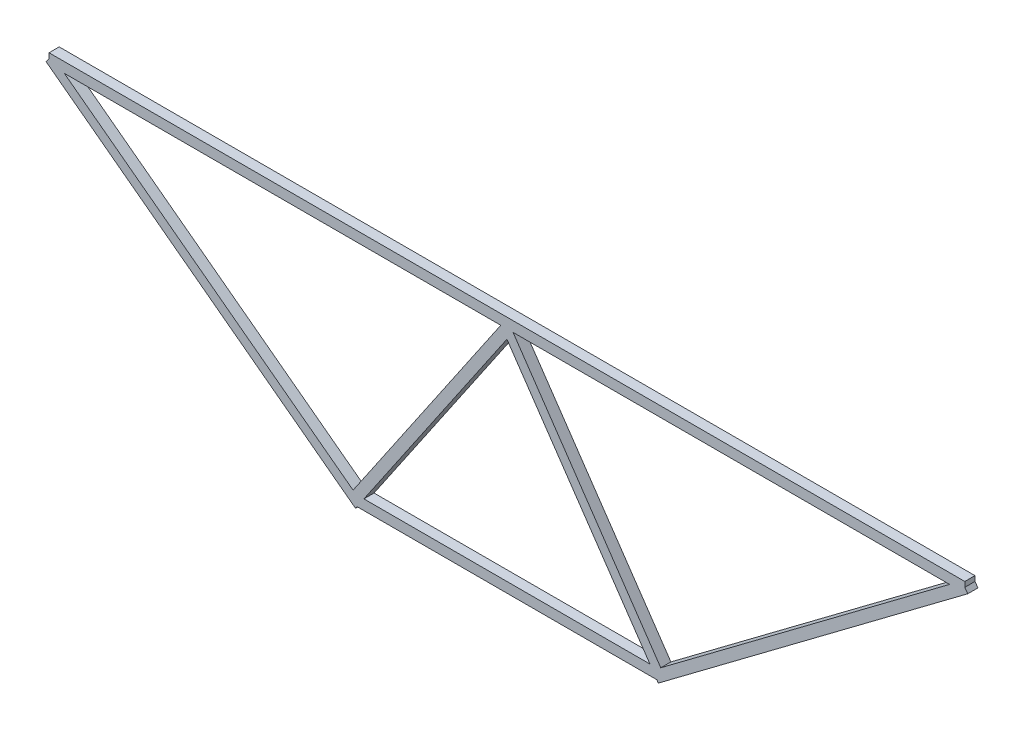
ISO-10303-21;
HEADER;
FILE_DESCRIPTION(('STEP AP214'),'2;1');
FILE_NAME('part.step','',(''),(''),'','','');
FILE_SCHEMA(('AUTOMOTIVE_DESIGN { 1 0 10303 214 1 1 1 1 }'));
ENDSEC;
DATA;
#1=APPLICATION_CONTEXT('core data for automotive mechanical design processes');
#2=APPLICATION_PROTOCOL_DEFINITION('international standard','automotive_design',2000,#1);
#3=PRODUCT_CONTEXT('',#1,'mechanical');
#4=PRODUCT('Part','Part','',(#3));
#5=PRODUCT_RELATED_PRODUCT_CATEGORY('part','',(#4));
#6=PRODUCT_DEFINITION_FORMATION('','',#4);
#7=PRODUCT_DEFINITION_CONTEXT('part definition',#1,'design');
#8=PRODUCT_DEFINITION('design','',#6,#7);
#9=PRODUCT_DEFINITION_SHAPE('','',#8);
#10=(LENGTH_UNIT() NAMED_UNIT(*) SI_UNIT(.MILLI.,.METRE.));
#11=(NAMED_UNIT(*) PLANE_ANGLE_UNIT() SI_UNIT($,.RADIAN.));
#12=(NAMED_UNIT(*) SI_UNIT($,.STERADIAN.) SOLID_ANGLE_UNIT());
#13=UNCERTAINTY_MEASURE_WITH_UNIT(LENGTH_MEASURE(1.E-05),#10,'distance_accuracy_value','');
#14=(GEOMETRIC_REPRESENTATION_CONTEXT(3) GLOBAL_UNCERTAINTY_ASSIGNED_CONTEXT((#13)) GLOBAL_UNIT_ASSIGNED_CONTEXT((#10,
#11,#12)) REPRESENTATION_CONTEXT('',''));
#15=CARTESIAN_POINT('',(0.,0.,0.));
#16=DIRECTION('',(0.,0.,1.));
#17=DIRECTION('',(1.,0.,0.));
#18=AXIS2_PLACEMENT_3D('',#15,#16,#17);
#19=CARTESIAN_POINT('',(405.494510894513,-310.396044584635,6.65));
#20=DIRECTION('',(-0.826242239776454,0.563314975133086,0.));
#21=DIRECTION('',(-0.563314975133086,-0.826242239776454,0.));
#22=AXIS2_PLACEMENT_3D('',#19,#20,#21);
#23=PLANE('',#22);
#24=DIRECTION('',(0.,0.,-1.));
#25=VECTOR('',#24,1.);
#26=CARTESIAN_POINT('',(403.514653785009,-313.3,6.65));
#27=LINE('',#26,#25);
#28=CARTESIAN_POINT('',(403.514653785009,-313.3,6.65));
#29=VERTEX_POINT('',#28);
#30=CARTESIAN_POINT('',(403.514653785009,-313.3,-6.65));
#31=VERTEX_POINT('',#30);
#32=EDGE_CURVE('E338',#29,#31,#27,.T.);
#33=ORIENTED_EDGE('',*,*,#32,.F.);
#34=DIRECTION('',(0.563314975133086,0.826242239776454,0.));
#35=VECTOR('',#34,1.);
#36=CARTESIAN_POINT('',(405.494510894513,-310.396044584635,6.65));
#37=LINE('',#36,#35);
#38=CARTESIAN_POINT('',(401.575558109468,-316.144168582101,6.65));
#39=VERTEX_POINT('',#38);
#40=EDGE_CURVE('E327',#39,#29,#37,.T.);
#41=ORIENTED_EDGE('',*,*,#40,.F.);
#42=DIRECTION('',(0.,0.,-1.));
#43=VECTOR('',#42,1.);
#44=CARTESIAN_POINT('',(401.575558109468,-316.144168582101,6.65));
#45=LINE('',#44,#43);
#46=CARTESIAN_POINT('',(401.575558109468,-316.144168582101,-6.65));
#47=VERTEX_POINT('',#46);
#48=EDGE_CURVE('E212',#39,#47,#45,.T.);
#49=ORIENTED_EDGE('',*,*,#48,.T.);
#50=DIRECTION('',(0.563314975133086,0.826242239776454,0.));
#51=VECTOR('',#50,1.);
#52=CARTESIAN_POINT('',(405.494510894513,-310.396044584635,-6.65));
#53=LINE('',#52,#51);
#54=EDGE_CURVE('E201',#47,#31,#53,.T.);
#55=ORIENTED_EDGE('',*,*,#54,.T.);
#56=EDGE_LOOP('',(#33,#41,#49,#55));
#57=FACE_BOUND('',#56,.T.);
#58=ADVANCED_FACE('F44',(#57),#23,.F.);
#59=CARTESIAN_POINT('',(594.505489105487,-17.046044584635,6.65));
#60=DIRECTION('',(0.826242239776454,0.563314975133086,0.));
#61=DIRECTION('',(-0.563314975133086,0.826242239776454,0.));
#62=AXIS2_PLACEMENT_3D('',#59,#60,#61);
#63=PLANE('',#62);
#64=DIRECTION('',(0.,0.,1.));
#65=VECTOR('',#64,1.);
#66=CARTESIAN_POINT('',(796.485346214991,-313.3,6.65));
#67=LINE('',#66,#65);
#68=CARTESIAN_POINT('',(796.485346214991,-313.3,-6.65));
#69=VERTEX_POINT('',#68);
#70=CARTESIAN_POINT('',(796.485346214991,-313.3,6.65));
#71=VERTEX_POINT('',#70);
#72=EDGE_CURVE('E11',#69,#71,#67,.T.);
#73=ORIENTED_EDGE('',*,*,#72,.F.);
#74=DIRECTION('',(0.563314975133086,-0.826242239776454,0.));
#75=VECTOR('',#74,1.);
#76=CARTESIAN_POINT('',(594.505489105487,-17.046044584635,-6.65));
#77=LINE('',#76,#75);
#78=CARTESIAN_POINT('',(798.424441890532,-316.144168582101,-6.65));
#79=VERTEX_POINT('',#78);
#80=EDGE_CURVE('E198',#69,#79,#77,.T.);
#81=ORIENTED_EDGE('',*,*,#80,.T.);
#82=DIRECTION('',(0.,0.,-1.));
#83=VECTOR('',#82,1.);
#84=CARTESIAN_POINT('',(798.424441890532,-316.144168582101,6.65));
#85=LINE('',#84,#83);
#86=CARTESIAN_POINT('',(798.424441890532,-316.144168582101,6.65));
#87=VERTEX_POINT('',#86);
#88=EDGE_CURVE('E210',#87,#79,#85,.T.);
#89=ORIENTED_EDGE('',*,*,#88,.F.);
#90=DIRECTION('',(0.563314975133086,-0.826242239776454,0.));
#91=VECTOR('',#90,1.);
#92=CARTESIAN_POINT('',(594.505489105487,-17.046044584635,6.65));
#93=LINE('',#92,#91);
#94=EDGE_CURVE('E335',#71,#87,#93,.T.);
#95=ORIENTED_EDGE('',*,*,#94,.F.);
#96=EDGE_LOOP('',(#73,#81,#89,#95));
#97=FACE_BOUND('',#96,.T.);
#98=ADVANCED_FACE('F400',(#97),#63,.F.);
#99=CARTESIAN_POINT('',(0.,-13.3,6.65));
#100=DIRECTION('',(0.,1.,0.));
#101=DIRECTION('',(0.,0.,1.));
#102=AXIS2_PLACEMENT_3D('',#99,#100,#101);
#103=PLANE('',#102);
#104=DIRECTION('',(1.,0.,0.));
#105=VECTOR('',#104,1.);
#106=CARTESIAN_POINT('',(0.,-13.3,-6.65));
#107=LINE('',#106,#105);
#108=CARTESIAN_POINT('',(608.048487089935,-13.3,-6.65));
#109=VERTEX_POINT('',#108);
#110=CARTESIAN_POINT('',(1180.05,-13.3,-6.65));
#111=VERTEX_POINT('',#110);
#112=EDGE_CURVE('E231',#109,#111,#107,.T.);
#113=ORIENTED_EDGE('',*,*,#112,.T.);
#114=DIRECTION('',(0.,0.,1.));
#115=VECTOR('',#114,1.);
#116=CARTESIAN_POINT('',(1180.05,-13.3,6.65));
#117=LINE('',#116,#115);
#118=CARTESIAN_POINT('',(1180.05,-13.3,6.65));
#119=VERTEX_POINT('',#118);
#120=EDGE_CURVE('E176',#111,#119,#117,.T.);
#121=ORIENTED_EDGE('',*,*,#120,.T.);
#122=DIRECTION('',(1.,0.,0.));
#123=VECTOR('',#122,1.);
#124=CARTESIAN_POINT('',(0.,-13.3,6.65));
#125=LINE('',#124,#123);
#126=CARTESIAN_POINT('',(608.048487089935,-13.3,6.65));
#127=VERTEX_POINT('',#126);
#128=EDGE_CURVE('E234',#127,#119,#125,.T.);
#129=ORIENTED_EDGE('',*,*,#128,.F.);
#130=DIRECTION('',(0.,0.,-1.));
#131=VECTOR('',#130,1.);
#132=CARTESIAN_POINT('',(608.048487089935,-13.3,6.65));
#133=LINE('',#132,#131);
#134=EDGE_CURVE('E283',#127,#109,#133,.T.);
#135=ORIENTED_EDGE('',*,*,#134,.T.);
#136=EDGE_LOOP('',(#113,#121,#129,#135));
#137=FACE_BOUND('',#136,.T.);
#138=ADVANCED_FACE('F291',(#137),#103,.F.);
#139=CARTESIAN_POINT('',(19.9499999999998,-13.3,-6.65));
#140=VERTEX_POINT('',#139);
#141=CARTESIAN_POINT('',(591.951512910065,-13.3,-6.65));
#142=VERTEX_POINT('',#141);
#143=EDGE_CURVE('E251',#140,#142,#107,.T.);
#144=ORIENTED_EDGE('',*,*,#143,.T.);
#145=DIRECTION('',(0.,0.,1.));
#146=VECTOR('',#145,1.);
#147=CARTESIAN_POINT('',(591.951512910065,-13.3,6.65));
#148=LINE('',#147,#146);
#149=CARTESIAN_POINT('',(591.951512910065,-13.3,6.65));
#150=VERTEX_POINT('',#149);
#151=EDGE_CURVE('E282',#142,#150,#148,.T.);
#152=ORIENTED_EDGE('',*,*,#151,.T.);
#153=CARTESIAN_POINT('',(19.9499999999998,-13.3,6.65));
#154=VERTEX_POINT('',#153);
#155=EDGE_CURVE('E236',#154,#150,#125,.T.);
#156=ORIENTED_EDGE('',*,*,#155,.F.);
#157=DIRECTION('',(0.,0.,-1.));
#158=VECTOR('',#157,1.);
#159=CARTESIAN_POINT('',(19.9499999999998,-13.3,6.65));
#160=LINE('',#159,#158);
#161=EDGE_CURVE('E279',#154,#140,#160,.T.);
#162=ORIENTED_EDGE('',*,*,#161,.T.);
#163=EDGE_LOOP('',(#144,#152,#156,#162));
#164=FACE_BOUND('',#163,.T.);
#165=ADVANCED_FACE('F50',(#164),#103,.F.);
#166=CARTESIAN_POINT('',(1200.,0.,6.65));
#167=DIRECTION('',(1.,0.,0.));
#168=DIRECTION('',(0.,0.,-1.));
#169=AXIS2_PLACEMENT_3D('',#166,#167,#168);
#170=PLANE('',#169);
#171=DIRECTION('',(0.,0.,1.));
#172=VECTOR('',#171,1.);
#173=CARTESIAN_POINT('',(1200.,-6.6499999999999,6.65));
#174=LINE('',#173,#172);
#175=CARTESIAN_POINT('',(1200.,-6.6499999999999,-6.65));
#176=VERTEX_POINT('',#175);
#177=CARTESIAN_POINT('',(1200.,-6.6499999999999,6.65));
#178=VERTEX_POINT('',#177);
#179=EDGE_CURVE('E273',#176,#178,#174,.T.);
#180=ORIENTED_EDGE('',*,*,#179,.F.);
#181=DIRECTION('',(0.,-1.,0.));
#182=VECTOR('',#181,1.);
#183=CARTESIAN_POINT('',(1200.,0.,-6.65));
#184=LINE('',#183,#182);
#185=CARTESIAN_POINT('',(1200.,0.,-6.65));
#186=VERTEX_POINT('',#185);
#187=EDGE_CURVE('E255',#186,#176,#184,.T.);
#188=ORIENTED_EDGE('',*,*,#187,.F.);
#189=DIRECTION('',(0.,0.,-1.));
#190=VECTOR('',#189,1.);
#191=CARTESIAN_POINT('',(1200.,0.,6.65));
#192=LINE('',#191,#190);
#193=CARTESIAN_POINT('',(1200.,0.,6.65));
#194=VERTEX_POINT('',#193);
#195=EDGE_CURVE('E270',#194,#186,#192,.T.);
#196=ORIENTED_EDGE('',*,*,#195,.F.);
#197=DIRECTION('',(0.,-1.,0.));
#198=VECTOR('',#197,1.);
#199=CARTESIAN_POINT('',(1200.,0.,6.65));
#200=LINE('',#199,#198);
#201=EDGE_CURVE('E238',#194,#178,#200,.T.);
#202=ORIENTED_EDGE('',*,*,#201,.T.);
#203=EDGE_LOOP('',(#180,#188,#196,#202));
#204=FACE_BOUND('',#203,.T.);
#205=ADVANCED_FACE('F559',(#204),#170,.T.);
#206=CARTESIAN_POINT('',(0.,0.,6.65));
#207=DIRECTION('',(0.,1.,0.));
#208=DIRECTION('',(0.,0.,1.));
#209=AXIS2_PLACEMENT_3D('',#206,#207,#208);
#210=PLANE('',#209);
#211=DIRECTION('',(1.,0.,0.));
#212=VECTOR('',#211,1.);
#213=CARTESIAN_POINT('',(0.,0.,-6.65));
#214=LINE('',#213,#212);
#215=CARTESIAN_POINT('',(0.,0.,-6.65));
#216=VERTEX_POINT('',#215);
#217=EDGE_CURVE('E256',#216,#186,#214,.T.);
#218=ORIENTED_EDGE('',*,*,#217,.F.);
#219=DIRECTION('',(0.,0.,-1.));
#220=VECTOR('',#219,1.);
#221=CARTESIAN_POINT('',(0.,0.,6.65));
#222=LINE('',#221,#220);
#223=CARTESIAN_POINT('',(0.,0.,6.65));
#224=VERTEX_POINT('',#223);
#225=EDGE_CURVE('E247',#224,#216,#222,.T.);
#226=ORIENTED_EDGE('',*,*,#225,.F.);
#227=DIRECTION('',(1.,0.,0.));
#228=VECTOR('',#227,1.);
#229=CARTESIAN_POINT('',(0.,0.,6.65));
#230=LINE('',#229,#228);
#231=EDGE_CURVE('E244',#224,#194,#230,.T.);
#232=ORIENTED_EDGE('',*,*,#231,.T.);
#233=ORIENTED_EDGE('',*,*,#195,.T.);
#234=EDGE_LOOP('',(#218,#226,#232,#233));
#235=FACE_BOUND('',#234,.T.);
#236=ADVANCED_FACE('F552',(#235),#210,.T.);
#237=CARTESIAN_POINT('',(0.,-13.3,6.65));
#238=DIRECTION('',(-1.,0.,0.));
#239=DIRECTION('',(0.,0.,1.));
#240=AXIS2_PLACEMENT_3D('',#237,#238,#239);
#241=PLANE('',#240);
#242=DIRECTION('',(0.,0.,-1.));
#243=VECTOR('',#242,1.);
#244=CARTESIAN_POINT('',(0.,-6.64999999999997,6.65));
#245=LINE('',#244,#243);
#246=CARTESIAN_POINT('',(0.,-6.64999999999997,6.65));
#247=VERTEX_POINT('',#246);
#248=CARTESIAN_POINT('',(0.,-6.64999999999997,-6.65));
#249=VERTEX_POINT('',#248);
#250=EDGE_CURVE('E269',#247,#249,#245,.T.);
#251=ORIENTED_EDGE('',*,*,#250,.F.);
#252=DIRECTION('',(0.,1.,0.));
#253=VECTOR('',#252,1.);
#254=CARTESIAN_POINT('',(0.,-13.3,6.65));
#255=LINE('',#254,#253);
#256=EDGE_CURVE('E250',#247,#224,#255,.T.);
#257=ORIENTED_EDGE('',*,*,#256,.T.);
#258=ORIENTED_EDGE('',*,*,#225,.T.);
#259=DIRECTION('',(0.,1.,0.));
#260=VECTOR('',#259,1.);
#261=CARTESIAN_POINT('',(0.,-13.3,-6.65));
#262=LINE('',#261,#260);
#263=EDGE_CURVE('E239',#249,#216,#262,.T.);
#264=ORIENTED_EDGE('',*,*,#263,.F.);
#265=EDGE_LOOP('',(#251,#257,#258,#264));
#266=FACE_BOUND('',#265,.T.);
#267=ADVANCED_FACE('F532',(#266),#241,.T.);
#268=CARTESIAN_POINT('',(0.,0.,6.65));
#269=DIRECTION('',(0.,0.,-1.));
#270=DIRECTION('',(-1.,0.,0.));
#271=AXIS2_PLACEMENT_3D('',#268,#269,#270);
#272=PLANE('',#271);
#273=DIRECTION('',(1.,0.,0.));
#274=VECTOR('',#273,1.);
#275=CARTESIAN_POINT('',(400.,-300.,6.65));
#276=LINE('',#275,#274);
#277=CARTESIAN_POINT('',(412.582320394861,-300.,6.65));
#278=VERTEX_POINT('',#277);
#279=CARTESIAN_POINT('',(787.417679605139,-300.,6.65));
#280=VERTEX_POINT('',#279);
#281=EDGE_CURVE('E68',#278,#280,#276,.T.);
#282=ORIENTED_EDGE('',*,*,#281,.F.);
#283=CARTESIAN_POINT('',(600.,-25.1051184391626,6.65));
#284=VERTEX_POINT('',#283);
#285=EDGE_CURVE('E330',#278,#284,#37,.T.);
#286=ORIENTED_EDGE('',*,*,#285,.T.);
#287=EDGE_CURVE('E211',#284,#280,#93,.T.);
#288=ORIENTED_EDGE('',*,*,#287,.T.);
#289=EDGE_LOOP('',(#282,#286,#288));
#290=FACE_BOUND('',#289,.T.);
#291=ORIENTED_EDGE('',*,*,#40,.T.);
#292=DIRECTION('',(1.,0.,0.));
#293=VECTOR('',#292,1.);
#294=CARTESIAN_POINT('',(400.,-313.3,6.65));
#295=LINE('',#294,#293);
#296=EDGE_CURVE('E190',#29,#71,#295,.T.);
#297=ORIENTED_EDGE('',*,*,#296,.T.);
#298=ORIENTED_EDGE('',*,*,#94,.T.);
#299=DIRECTION('',(0.8,0.6,0.));
#300=VECTOR('',#299,1.);
#301=CARTESIAN_POINT('',(803.99,-311.97,6.65));
#302=LINE('',#301,#300);
#303=CARTESIAN_POINT('',(1203.99,-11.97,6.65));
#304=VERTEX_POINT('',#303);
#305=EDGE_CURVE('E192',#87,#304,#302,.T.);
#306=ORIENTED_EDGE('',*,*,#305,.T.);
#307=DIRECTION('',(0.600000000000005,-0.799999999999996,0.));
#308=VECTOR('',#307,1.);
#309=CARTESIAN_POINT('',(1196.01,-1.33000000000005,6.65));
#310=LINE('',#309,#308);
#311=EDGE_CURVE('E203',#178,#304,#310,.T.);
#312=ORIENTED_EDGE('',*,*,#311,.F.);
#313=ORIENTED_EDGE('',*,*,#201,.F.);
#314=ORIENTED_EDGE('',*,*,#231,.F.);
#315=ORIENTED_EDGE('',*,*,#256,.F.);
#316=DIRECTION('',(0.6,0.8,0.));
#317=VECTOR('',#316,1.);
#318=CARTESIAN_POINT('',(-3.99000000000005,-11.97,6.65));
#319=LINE('',#318,#317);
#320=CARTESIAN_POINT('',(-3.99000000000005,-11.97,6.65));
#321=VERTEX_POINT('',#320);
#322=EDGE_CURVE('E319',#321,#247,#319,.T.);
#323=ORIENTED_EDGE('',*,*,#322,.F.);
#324=DIRECTION('',(0.8,-0.6,0.));
#325=VECTOR('',#324,1.);
#326=CARTESIAN_POINT('',(396.01,-311.97,6.65));
#327=LINE('',#326,#325);
#328=EDGE_CURVE('E322',#321,#39,#327,.T.);
#329=ORIENTED_EDGE('',*,*,#328,.T.);
#330=EDGE_LOOP('',(#291,#297,#298,#306,#312,#313,#314,#315,#323,#329));
#331=FACE_BOUND('',#330,.T.);
#332=DIRECTION('',(0.8,-0.6,0.));
#333=VECTOR('',#332,1.);
#334=CARTESIAN_POINT('',(403.99,-301.33,6.65));
#335=LINE('',#334,#333);
#336=CARTESIAN_POINT('',(398.424441890532,-297.155831417899,6.65));
#337=VERTEX_POINT('',#336);
#338=EDGE_CURVE('E320',#154,#337,#335,.T.);
#339=ORIENTED_EDGE('',*,*,#338,.F.);
#340=ORIENTED_EDGE('',*,*,#155,.T.);
#341=DIRECTION('',(0.563314975133086,0.826242239776454,0.));
#342=VECTOR('',#341,1.);
#343=CARTESIAN_POINT('',(394.505489105487,-302.903955415365,6.65));
#344=LINE('',#343,#342);
#345=EDGE_CURVE('E313',#337,#150,#344,.T.);
#346=ORIENTED_EDGE('',*,*,#345,.F.);
#347=EDGE_LOOP('',(#339,#340,#346));
#348=FACE_BOUND('',#347,.T.);
#349=DIRECTION('',(0.563314975133086,-0.826242239776454,0.));
#350=VECTOR('',#349,1.);
#351=CARTESIAN_POINT('',(605.494510894513,-9.55395541536498,6.65));
#352=LINE('',#351,#350);
#353=CARTESIAN_POINT('',(801.575558109468,-297.155831417899,6.65));
#354=VERTEX_POINT('',#353);
#355=EDGE_CURVE('E304',#127,#354,#352,.T.);
#356=ORIENTED_EDGE('',*,*,#355,.F.);
#357=ORIENTED_EDGE('',*,*,#128,.T.);
#358=DIRECTION('',(0.8,0.6,0.));
#359=VECTOR('',#358,1.);
#360=CARTESIAN_POINT('',(796.01,-301.33,6.65));
#361=LINE('',#360,#359);
#362=EDGE_CURVE('E301',#354,#119,#361,.T.);
#363=ORIENTED_EDGE('',*,*,#362,.F.);
#364=EDGE_LOOP('',(#356,#357,#363));
#365=FACE_BOUND('',#364,.T.);
#366=ADVANCED_FACE('F305',(#290,#331,#348,#365),#272,.F.);
#367=CARTESIAN_POINT('',(0.,0.,-6.65));
#368=DIRECTION('',(0.,0.,-1.));
#369=DIRECTION('',(-1.,0.,0.));
#370=AXIS2_PLACEMENT_3D('',#367,#368,#369);
#371=PLANE('',#370);
#372=ORIENTED_EDGE('',*,*,#80,.F.);
#373=DIRECTION('',(1.,0.,0.));
#374=VECTOR('',#373,1.);
#375=CARTESIAN_POINT('',(400.,-313.3,-6.65));
#376=LINE('',#375,#374);
#377=EDGE_CURVE('E189',#31,#69,#376,.T.);
#378=ORIENTED_EDGE('',*,*,#377,.F.);
#379=ORIENTED_EDGE('',*,*,#54,.F.);
#380=DIRECTION('',(0.8,-0.6,0.));
#381=VECTOR('',#380,1.);
#382=CARTESIAN_POINT('',(396.01,-311.97,-6.65));
#383=LINE('',#382,#381);
#384=CARTESIAN_POINT('',(-3.99000000000005,-11.97,-6.65));
#385=VERTEX_POINT('',#384);
#386=EDGE_CURVE('E359',#385,#47,#383,.T.);
#387=ORIENTED_EDGE('',*,*,#386,.F.);
#388=DIRECTION('',(0.6,0.8,0.));
#389=VECTOR('',#388,1.);
#390=CARTESIAN_POINT('',(-3.99000000000005,-11.97,-6.65));
#391=LINE('',#390,#389);
#392=EDGE_CURVE('E358',#385,#249,#391,.T.);
#393=ORIENTED_EDGE('',*,*,#392,.T.);
#394=ORIENTED_EDGE('',*,*,#263,.T.);
#395=ORIENTED_EDGE('',*,*,#217,.T.);
#396=ORIENTED_EDGE('',*,*,#187,.T.);
#397=DIRECTION('',(0.600000000000005,-0.799999999999996,0.));
#398=VECTOR('',#397,1.);
#399=CARTESIAN_POINT('',(1196.01,-1.33000000000005,-6.65));
#400=LINE('',#399,#398);
#401=CARTESIAN_POINT('',(1203.99,-11.97,-6.65));
#402=VERTEX_POINT('',#401);
#403=EDGE_CURVE('E336',#176,#402,#400,.T.);
#404=ORIENTED_EDGE('',*,*,#403,.T.);
#405=DIRECTION('',(0.8,0.6,0.));
#406=VECTOR('',#405,1.);
#407=CARTESIAN_POINT('',(803.99,-311.97,-6.65));
#408=LINE('',#407,#406);
#409=EDGE_CURVE('E333',#79,#402,#408,.T.);
#410=ORIENTED_EDGE('',*,*,#409,.F.);
#411=EDGE_LOOP('',(#372,#378,#379,#387,#393,#394,#395,#396,#404,#410));
#412=FACE_BOUND('',#411,.T.);
#413=CARTESIAN_POINT('',(412.582320394861,-300.,-6.65));
#414=VERTEX_POINT('',#413);
#415=CARTESIAN_POINT('',(600.,-25.1051184391626,-6.65));
#416=VERTEX_POINT('',#415);
#417=EDGE_CURVE('E183',#414,#416,#53,.T.);
#418=ORIENTED_EDGE('',*,*,#417,.F.);
#419=DIRECTION('',(1.,0.,0.));
#420=VECTOR('',#419,1.);
#421=CARTESIAN_POINT('',(400.,-300.,-6.65));
#422=LINE('',#421,#420);
#423=CARTESIAN_POINT('',(787.417679605139,-300.,-6.65));
#424=VERTEX_POINT('',#423);
#425=EDGE_CURVE('E62',#414,#424,#422,.T.);
#426=ORIENTED_EDGE('',*,*,#425,.T.);
#427=EDGE_CURVE('E184',#416,#424,#77,.T.);
#428=ORIENTED_EDGE('',*,*,#427,.F.);
#429=EDGE_LOOP('',(#418,#426,#428));
#430=FACE_BOUND('',#429,.T.);
#431=ORIENTED_EDGE('',*,*,#143,.F.);
#432=DIRECTION('',(0.8,-0.6,0.));
#433=VECTOR('',#432,1.);
#434=CARTESIAN_POINT('',(403.99,-301.33,-6.65));
#435=LINE('',#434,#433);
#436=CARTESIAN_POINT('',(398.424441890532,-297.155831417899,-6.65));
#437=VERTEX_POINT('',#436);
#438=EDGE_CURVE('E354',#140,#437,#435,.T.);
#439=ORIENTED_EDGE('',*,*,#438,.T.);
#440=DIRECTION('',(0.563314975133086,0.826242239776454,0.));
#441=VECTOR('',#440,1.);
#442=CARTESIAN_POINT('',(394.505489105487,-302.903955415365,-6.65));
#443=LINE('',#442,#441);
#444=EDGE_CURVE('E349',#437,#142,#443,.T.);
#445=ORIENTED_EDGE('',*,*,#444,.T.);
#446=EDGE_LOOP('',(#431,#439,#445));
#447=FACE_BOUND('',#446,.T.);
#448=ORIENTED_EDGE('',*,*,#112,.F.);
#449=DIRECTION('',(0.563314975133086,-0.826242239776454,0.));
#450=VECTOR('',#449,1.);
#451=CARTESIAN_POINT('',(605.494510894513,-9.55395541536498,-6.65));
#452=LINE('',#451,#450);
#453=CARTESIAN_POINT('',(801.575558109468,-297.155831417899,-6.65));
#454=VERTEX_POINT('',#453);
#455=EDGE_CURVE('E347',#109,#454,#452,.T.);
#456=ORIENTED_EDGE('',*,*,#455,.T.);
#457=DIRECTION('',(0.8,0.6,0.));
#458=VECTOR('',#457,1.);
#459=CARTESIAN_POINT('',(796.01,-301.33,-6.65));
#460=LINE('',#459,#458);
#461=EDGE_CURVE('E341',#454,#111,#460,.T.);
#462=ORIENTED_EDGE('',*,*,#461,.T.);
#463=EDGE_LOOP('',(#448,#456,#462));
#464=FACE_BOUND('',#463,.T.);
#465=ADVANCED_FACE('F185',(#412,#430,#447,#464),#371,.T.);
#466=CARTESIAN_POINT('',(796.01,-301.33,6.65));
#467=DIRECTION('',(-0.6,0.8,0.));
#468=DIRECTION('',(-0.8,-0.6,0.));
#469=AXIS2_PLACEMENT_3D('',#466,#467,#468);
#470=PLANE('',#469);
#471=ORIENTED_EDGE('',*,*,#120,.F.);
#472=ORIENTED_EDGE('',*,*,#461,.F.);
#473=DIRECTION('',(0.,0.,-1.));
#474=VECTOR('',#473,1.);
#475=CARTESIAN_POINT('',(801.575558109468,-297.155831417899,6.65));
#476=LINE('',#475,#474);
#477=EDGE_CURVE('E223',#354,#454,#476,.T.);
#478=ORIENTED_EDGE('',*,*,#477,.F.);
#479=ORIENTED_EDGE('',*,*,#362,.T.);
#480=EDGE_LOOP('',(#471,#472,#478,#479));
#481=FACE_BOUND('',#480,.T.);
#482=ADVANCED_FACE('F308',(#481),#470,.T.);
#483=CARTESIAN_POINT('',(605.494510894513,-9.55395541536498,6.65));
#484=DIRECTION('',(0.826242239776454,0.563314975133086,0.));
#485=DIRECTION('',(-0.563314975133086,0.826242239776454,0.));
#486=AXIS2_PLACEMENT_3D('',#483,#484,#485);
#487=PLANE('',#486);
#488=ORIENTED_EDGE('',*,*,#134,.F.);
#489=ORIENTED_EDGE('',*,*,#355,.T.);
#490=ORIENTED_EDGE('',*,*,#477,.T.);
#491=ORIENTED_EDGE('',*,*,#455,.F.);
#492=EDGE_LOOP('',(#488,#489,#490,#491));
#493=FACE_BOUND('',#492,.T.);
#494=ADVANCED_FACE('F499',(#493),#487,.T.);
#495=CARTESIAN_POINT('',(394.505489105487,-302.903955415365,6.65));
#496=DIRECTION('',(-0.826242239776454,0.563314975133086,0.));
#497=DIRECTION('',(-0.563314975133086,-0.826242239776454,0.));
#498=AXIS2_PLACEMENT_3D('',#495,#496,#497);
#499=PLANE('',#498);
#500=ORIENTED_EDGE('',*,*,#151,.F.);
#501=ORIENTED_EDGE('',*,*,#444,.F.);
#502=DIRECTION('',(0.,0.,-1.));
#503=VECTOR('',#502,1.);
#504=CARTESIAN_POINT('',(398.424441890532,-297.155831417899,6.65));
#505=LINE('',#504,#503);
#506=EDGE_CURVE('E222',#337,#437,#505,.T.);
#507=ORIENTED_EDGE('',*,*,#506,.F.);
#508=ORIENTED_EDGE('',*,*,#345,.T.);
#509=EDGE_LOOP('',(#500,#501,#507,#508));
#510=FACE_BOUND('',#509,.T.);
#511=ADVANCED_FACE('F488',(#510),#499,.T.);
#512=CARTESIAN_POINT('',(403.99,-301.33,6.65));
#513=DIRECTION('',(0.6,0.8,0.));
#514=DIRECTION('',(-0.8,0.6,0.));
#515=AXIS2_PLACEMENT_3D('',#512,#513,#514);
#516=PLANE('',#515);
#517=ORIENTED_EDGE('',*,*,#161,.F.);
#518=ORIENTED_EDGE('',*,*,#338,.T.);
#519=ORIENTED_EDGE('',*,*,#506,.T.);
#520=ORIENTED_EDGE('',*,*,#438,.F.);
#521=EDGE_LOOP('',(#517,#518,#519,#520));
#522=FACE_BOUND('',#521,.T.);
#523=ADVANCED_FACE('F476',(#522),#516,.T.);
#524=CARTESIAN_POINT('',(803.99,-311.97,6.65));
#525=DIRECTION('',(-0.6,0.8,0.));
#526=DIRECTION('',(-0.8,-0.6,0.));
#527=AXIS2_PLACEMENT_3D('',#524,#525,#526);
#528=PLANE('',#527);
#529=ORIENTED_EDGE('',*,*,#409,.T.);
#530=DIRECTION('',(0.,0.,-1.));
#531=VECTOR('',#530,1.);
#532=CARTESIAN_POINT('',(1203.99,-11.97,6.65));
#533=LINE('',#532,#531);
#534=EDGE_CURVE('E226',#304,#402,#533,.T.);
#535=ORIENTED_EDGE('',*,*,#534,.F.);
#536=ORIENTED_EDGE('',*,*,#305,.F.);
#537=ORIENTED_EDGE('',*,*,#88,.T.);
#538=EDGE_LOOP('',(#529,#535,#536,#537));
#539=FACE_BOUND('',#538,.T.);
#540=ADVANCED_FACE('F466',(#539),#528,.F.);
#541=CARTESIAN_POINT('',(1196.01,-1.33000000000005,6.65));
#542=DIRECTION('',(0.799999999999996,0.600000000000005,0.));
#543=DIRECTION('',(-0.600000000000005,0.799999999999996,0.));
#544=AXIS2_PLACEMENT_3D('',#541,#542,#543);
#545=PLANE('',#544);
#546=ORIENTED_EDGE('',*,*,#403,.F.);
#547=ORIENTED_EDGE('',*,*,#179,.T.);
#548=ORIENTED_EDGE('',*,*,#311,.T.);
#549=ORIENTED_EDGE('',*,*,#534,.T.);
#550=EDGE_LOOP('',(#546,#547,#548,#549));
#551=FACE_BOUND('',#550,.T.);
#552=ADVANCED_FACE('F456',(#551),#545,.T.);
#553=CARTESIAN_POINT('',(-3.99000000000005,-11.97,6.65));
#554=DIRECTION('',(-0.8,0.6,0.));
#555=DIRECTION('',(-0.6,-0.8,0.));
#556=AXIS2_PLACEMENT_3D('',#553,#554,#555);
#557=PLANE('',#556);
#558=ORIENTED_EDGE('',*,*,#322,.T.);
#559=ORIENTED_EDGE('',*,*,#250,.T.);
#560=ORIENTED_EDGE('',*,*,#392,.F.);
#561=DIRECTION('',(0.,0.,-1.));
#562=VECTOR('',#561,1.);
#563=CARTESIAN_POINT('',(-3.99000000000005,-11.97,6.65));
#564=LINE('',#563,#562);
#565=EDGE_CURVE('E217',#321,#385,#564,.T.);
#566=ORIENTED_EDGE('',*,*,#565,.F.);
#567=EDGE_LOOP('',(#558,#559,#560,#566));
#568=FACE_BOUND('',#567,.T.);
#569=ADVANCED_FACE('F415',(#568),#557,.T.);
#570=CARTESIAN_POINT('',(396.01,-311.97,6.65));
#571=DIRECTION('',(0.6,0.8,0.));
#572=DIRECTION('',(-0.8,0.6,0.));
#573=AXIS2_PLACEMENT_3D('',#570,#571,#572);
#574=PLANE('',#573);
#575=ORIENTED_EDGE('',*,*,#386,.T.);
#576=ORIENTED_EDGE('',*,*,#48,.F.);
#577=ORIENTED_EDGE('',*,*,#328,.F.);
#578=ORIENTED_EDGE('',*,*,#565,.T.);
#579=EDGE_LOOP('',(#575,#576,#577,#578));
#580=FACE_BOUND('',#579,.T.);
#581=ADVANCED_FACE('F403',(#580),#574,.F.);
#582=ORIENTED_EDGE('',*,*,#285,.F.);
#583=DIRECTION('',(0.,0.,-1.));
#584=VECTOR('',#583,1.);
#585=CARTESIAN_POINT('',(412.582320394861,-300.,6.65));
#586=LINE('',#585,#584);
#587=EDGE_CURVE('E383',#278,#414,#586,.T.);
#588=ORIENTED_EDGE('',*,*,#587,.T.);
#589=ORIENTED_EDGE('',*,*,#417,.T.);
#590=DIRECTION('',(0.,0.,-1.));
#591=VECTOR('',#590,1.);
#592=CARTESIAN_POINT('',(600.,-25.1051184391626,6.65));
#593=LINE('',#592,#591);
#594=EDGE_CURVE('E191',#284,#416,#593,.T.);
#595=ORIENTED_EDGE('',*,*,#594,.F.);
#596=EDGE_LOOP('',(#582,#588,#589,#595));
#597=FACE_BOUND('',#596,.T.);
#598=ADVANCED_FACE('F401',(#597),#23,.F.);
#599=ORIENTED_EDGE('',*,*,#427,.T.);
#600=DIRECTION('',(0.,0.,1.));
#601=VECTOR('',#600,1.);
#602=CARTESIAN_POINT('',(787.417679605139,-300.,6.65));
#603=LINE('',#602,#601);
#604=EDGE_CURVE('E53',#424,#280,#603,.T.);
#605=ORIENTED_EDGE('',*,*,#604,.T.);
#606=ORIENTED_EDGE('',*,*,#287,.F.);
#607=ORIENTED_EDGE('',*,*,#594,.T.);
#608=EDGE_LOOP('',(#599,#605,#606,#607));
#609=FACE_BOUND('',#608,.T.);
#610=ADVANCED_FACE('F193',(#609),#63,.F.);
#611=CARTESIAN_POINT('',(400.,-313.3,6.65));
#612=DIRECTION('',(0.,1.,0.));
#613=DIRECTION('',(0.,0.,1.));
#614=AXIS2_PLACEMENT_3D('',#611,#612,#613);
#615=PLANE('',#614);
#616=ORIENTED_EDGE('',*,*,#296,.F.);
#617=ORIENTED_EDGE('',*,*,#32,.T.);
#618=ORIENTED_EDGE('',*,*,#377,.T.);
#619=ORIENTED_EDGE('',*,*,#72,.T.);
#620=EDGE_LOOP('',(#616,#617,#618,#619));
#621=FACE_BOUND('',#620,.T.);
#622=ADVANCED_FACE('F389',(#621),#615,.F.);
#623=CARTESIAN_POINT('',(400.,-300.,6.65));
#624=DIRECTION('',(0.,1.,0.));
#625=DIRECTION('',(0.,0.,1.));
#626=AXIS2_PLACEMENT_3D('',#623,#624,#625);
#627=PLANE('',#626);
#628=ORIENTED_EDGE('',*,*,#587,.F.);
#629=ORIENTED_EDGE('',*,*,#281,.T.);
#630=ORIENTED_EDGE('',*,*,#604,.F.);
#631=ORIENTED_EDGE('',*,*,#425,.F.);
#632=EDGE_LOOP('',(#628,#629,#630,#631));
#633=FACE_BOUND('',#632,.T.);
#634=ADVANCED_FACE('F175',(#633),#627,.T.);
#635=CLOSED_SHELL('',(#58,#98,#138,#165,#205,#236,#267,#366,#465,#482,#494,#511,#523,#540,#552,
#569,#581,#598,#610,#622,#634));
#636=MANIFOLD_SOLID_BREP('B2',#635);
#637=ADVANCED_BREP_SHAPE_REPRESENTATION('',(#18,#636),#14);
#638=SHAPE_DEFINITION_REPRESENTATION(#9,#637);
ENDSEC;
END-ISO-10303-21;
